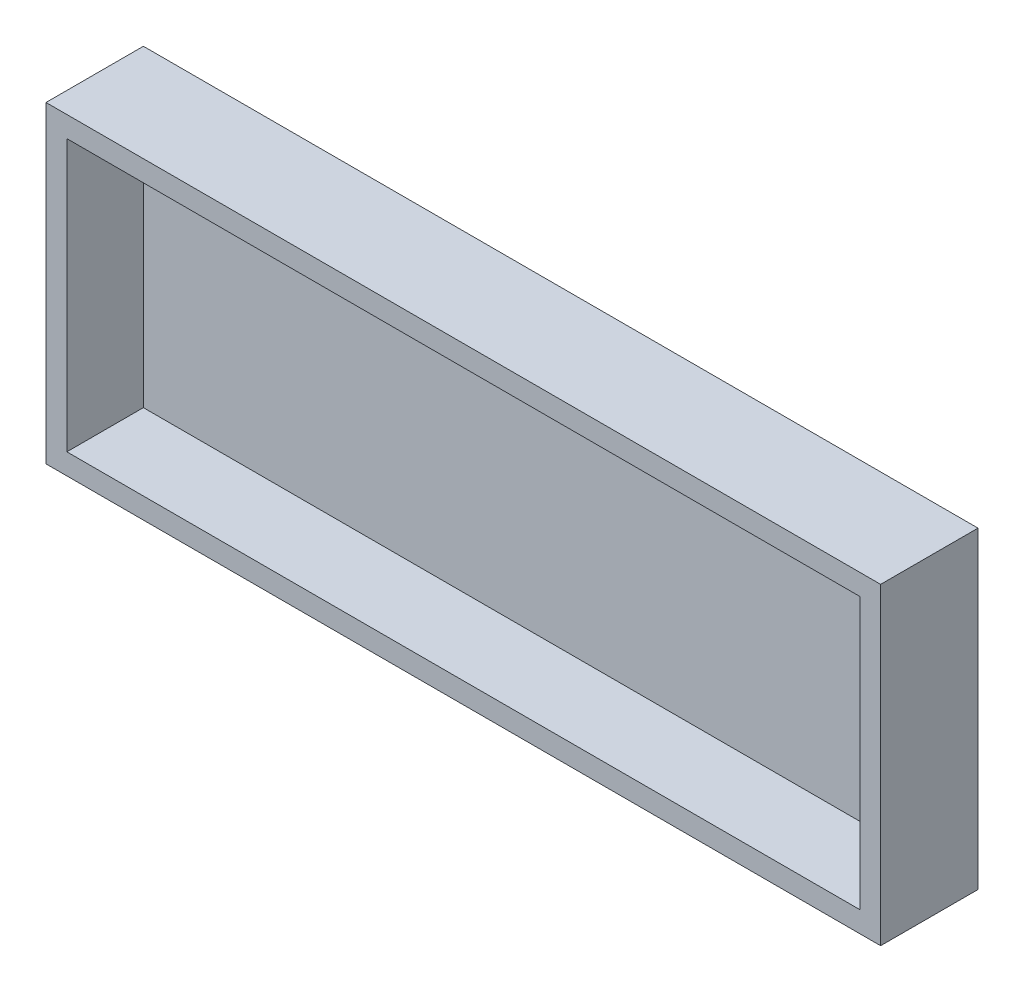
ISO-10303-21;
HEADER;
FILE_DESCRIPTION(('STEP AP214'),'2;1');
FILE_NAME('part.step','',(''),(''),'','','');
FILE_SCHEMA(('AUTOMOTIVE_DESIGN { 1 0 10303 214 1 1 1 1 }'));
ENDSEC;
DATA;
#1=APPLICATION_CONTEXT('core data for automotive mechanical design processes');
#2=APPLICATION_PROTOCOL_DEFINITION('international standard','automotive_design',2000,#1);
#3=PRODUCT_CONTEXT('',#1,'mechanical');
#4=PRODUCT('Part','Part','',(#3));
#5=PRODUCT_RELATED_PRODUCT_CATEGORY('part','',(#4));
#6=PRODUCT_DEFINITION_FORMATION('','',#4);
#7=PRODUCT_DEFINITION_CONTEXT('part definition',#1,'design');
#8=PRODUCT_DEFINITION('design','',#6,#7);
#9=PRODUCT_DEFINITION_SHAPE('','',#8);
#10=(LENGTH_UNIT() NAMED_UNIT(*) SI_UNIT(.MILLI.,.METRE.));
#11=(NAMED_UNIT(*) PLANE_ANGLE_UNIT() SI_UNIT($,.RADIAN.));
#12=(NAMED_UNIT(*) SI_UNIT($,.STERADIAN.) SOLID_ANGLE_UNIT());
#13=UNCERTAINTY_MEASURE_WITH_UNIT(LENGTH_MEASURE(1.E-05),#10,'distance_accuracy_value','');
#14=(GEOMETRIC_REPRESENTATION_CONTEXT(3) GLOBAL_UNCERTAINTY_ASSIGNED_CONTEXT((#13)) GLOBAL_UNIT_ASSIGNED_CONTEXT((#10,
#11,#12)) REPRESENTATION_CONTEXT('',''));
#15=CARTESIAN_POINT('',(0.,0.,0.));
#16=DIRECTION('',(0.,0.,1.));
#17=DIRECTION('',(1.,0.,0.));
#18=AXIS2_PLACEMENT_3D('',#15,#16,#17);
#19=CARTESIAN_POINT('',(60.,22.5,14.));
#20=DIRECTION('',(-1.,0.,0.));
#21=DIRECTION('',(0.,-1.,0.));
#22=AXIS2_PLACEMENT_3D('',#19,#20,#21);
#23=PLANE('',#22);
#24=DIRECTION('',(0.,1.,0.));
#25=VECTOR('',#24,1.);
#26=CARTESIAN_POINT('',(60.,22.5,0.));
#27=LINE('',#26,#25);
#28=CARTESIAN_POINT('',(60.,-22.5,0.));
#29=VERTEX_POINT('',#28);
#30=CARTESIAN_POINT('',(60.,22.5,0.));
#31=VERTEX_POINT('',#30);
#32=EDGE_CURVE('E173',#29,#31,#27,.T.);
#33=ORIENTED_EDGE('',*,*,#32,.T.);
#34=DIRECTION('',(0.,0.,-1.));
#35=VECTOR('',#34,1.);
#36=CARTESIAN_POINT('',(60.,22.5,14.));
#37=LINE('',#36,#35);
#38=CARTESIAN_POINT('',(60.,22.5,14.));
#39=VERTEX_POINT('',#38);
#40=EDGE_CURVE('E11',#39,#31,#37,.T.);
#41=ORIENTED_EDGE('',*,*,#40,.F.);
#42=DIRECTION('',(0.,1.,0.));
#43=VECTOR('',#42,1.);
#44=CARTESIAN_POINT('',(60.,22.5,14.));
#45=LINE('',#44,#43);
#46=CARTESIAN_POINT('',(60.,-22.5,14.));
#47=VERTEX_POINT('',#46);
#48=EDGE_CURVE('E162',#47,#39,#45,.T.);
#49=ORIENTED_EDGE('',*,*,#48,.F.);
#50=DIRECTION('',(0.,0.,-1.));
#51=VECTOR('',#50,1.);
#52=CARTESIAN_POINT('',(60.,-22.5,14.));
#53=LINE('',#52,#51);
#54=EDGE_CURVE('E172',#47,#29,#53,.T.);
#55=ORIENTED_EDGE('',*,*,#54,.T.);
#56=EDGE_LOOP('',(#33,#41,#49,#55));
#57=FACE_BOUND('',#56,.T.);
#58=ADVANCED_FACE('F45',(#57),#23,.F.);
#59=CARTESIAN_POINT('',(-60.,22.5,14.));
#60=DIRECTION('',(0.,-1.,0.));
#61=DIRECTION('',(0.,0.,-1.));
#62=AXIS2_PLACEMENT_3D('',#59,#60,#61);
#63=PLANE('',#62);
#64=DIRECTION('',(-1.,0.,0.));
#65=VECTOR('',#64,1.);
#66=CARTESIAN_POINT('',(-60.,22.5,0.));
#67=LINE('',#66,#65);
#68=CARTESIAN_POINT('',(-60.,22.5,0.));
#69=VERTEX_POINT('',#68);
#70=EDGE_CURVE('E177',#31,#69,#67,.T.);
#71=ORIENTED_EDGE('',*,*,#70,.T.);
#72=DIRECTION('',(0.,0.,-1.));
#73=VECTOR('',#72,1.);
#74=CARTESIAN_POINT('',(-60.,22.5,14.));
#75=LINE('',#74,#73);
#76=CARTESIAN_POINT('',(-60.,22.5,14.));
#77=VERTEX_POINT('',#76);
#78=EDGE_CURVE('E53',#77,#69,#75,.T.);
#79=ORIENTED_EDGE('',*,*,#78,.F.);
#80=DIRECTION('',(-1.,0.,0.));
#81=VECTOR('',#80,1.);
#82=CARTESIAN_POINT('',(-60.,22.5,14.));
#83=LINE('',#82,#81);
#84=EDGE_CURVE('E97',#39,#77,#83,.T.);
#85=ORIENTED_EDGE('',*,*,#84,.F.);
#86=ORIENTED_EDGE('',*,*,#40,.T.);
#87=EDGE_LOOP('',(#71,#79,#85,#86));
#88=FACE_BOUND('',#87,.T.);
#89=ADVANCED_FACE('F213',(#88),#63,.F.);
#90=CARTESIAN_POINT('',(-60.,22.5,14.));
#91=DIRECTION('',(1.,0.,0.));
#92=DIRECTION('',(0.,1.,0.));
#93=AXIS2_PLACEMENT_3D('',#90,#91,#92);
#94=PLANE('',#93);
#95=DIRECTION('',(0.,-1.,0.));
#96=VECTOR('',#95,1.);
#97=CARTESIAN_POINT('',(-60.,22.5,0.));
#98=LINE('',#97,#96);
#99=CARTESIAN_POINT('',(-60.,-22.5,0.));
#100=VERTEX_POINT('',#99);
#101=EDGE_CURVE('E180',#69,#100,#98,.T.);
#102=ORIENTED_EDGE('',*,*,#101,.T.);
#103=DIRECTION('',(0.,0.,-1.));
#104=VECTOR('',#103,1.);
#105=CARTESIAN_POINT('',(-60.,-22.5,14.));
#106=LINE('',#105,#104);
#107=CARTESIAN_POINT('',(-60.,-22.5,14.));
#108=VERTEX_POINT('',#107);
#109=EDGE_CURVE('E187',#108,#100,#106,.T.);
#110=ORIENTED_EDGE('',*,*,#109,.F.);
#111=DIRECTION('',(0.,-1.,0.));
#112=VECTOR('',#111,1.);
#113=CARTESIAN_POINT('',(-60.,22.5,14.));
#114=LINE('',#113,#112);
#115=EDGE_CURVE('E167',#77,#108,#114,.T.);
#116=ORIENTED_EDGE('',*,*,#115,.F.);
#117=ORIENTED_EDGE('',*,*,#78,.T.);
#118=EDGE_LOOP('',(#102,#110,#116,#117));
#119=FACE_BOUND('',#118,.T.);
#120=ADVANCED_FACE('F194',(#119),#94,.F.);
#121=CARTESIAN_POINT('',(-60.,-22.5,14.));
#122=DIRECTION('',(0.,1.,0.));
#123=DIRECTION('',(0.,0.,1.));
#124=AXIS2_PLACEMENT_3D('',#121,#122,#123);
#125=PLANE('',#124);
#126=DIRECTION('',(1.,0.,0.));
#127=VECTOR('',#126,1.);
#128=CARTESIAN_POINT('',(-60.,-22.5,0.));
#129=LINE('',#128,#127);
#130=EDGE_CURVE('E90',#100,#29,#129,.T.);
#131=ORIENTED_EDGE('',*,*,#130,.T.);
#132=ORIENTED_EDGE('',*,*,#54,.F.);
#133=DIRECTION('',(1.,0.,0.));
#134=VECTOR('',#133,1.);
#135=CARTESIAN_POINT('',(-60.,-22.5,14.));
#136=LINE('',#135,#134);
#137=EDGE_CURVE('E69',#108,#47,#136,.T.);
#138=ORIENTED_EDGE('',*,*,#137,.F.);
#139=ORIENTED_EDGE('',*,*,#109,.T.);
#140=EDGE_LOOP('',(#131,#132,#138,#139));
#141=FACE_BOUND('',#140,.T.);
#142=ADVANCED_FACE('F202',(#141),#125,.F.);
#143=CARTESIAN_POINT('',(0.,0.,14.));
#144=DIRECTION('',(0.,0.,1.));
#145=DIRECTION('',(1.,0.,0.));
#146=AXIS2_PLACEMENT_3D('',#143,#144,#145);
#147=PLANE('',#146);
#148=DIRECTION('',(0.,1.,0.));
#149=VECTOR('',#148,1.);
#150=CARTESIAN_POINT('',(57.,22.5,14.));
#151=LINE('',#150,#149);
#152=CARTESIAN_POINT('',(57.,-19.5,14.));
#153=VERTEX_POINT('',#152);
#154=CARTESIAN_POINT('',(57.,19.5,14.));
#155=VERTEX_POINT('',#154);
#156=EDGE_CURVE('E146',#153,#155,#151,.T.);
#157=ORIENTED_EDGE('',*,*,#156,.F.);
#158=DIRECTION('',(1.,0.,0.));
#159=VECTOR('',#158,1.);
#160=CARTESIAN_POINT('',(-60.,-19.5,14.));
#161=LINE('',#160,#159);
#162=CARTESIAN_POINT('',(-57.,-19.5,14.));
#163=VERTEX_POINT('',#162);
#164=EDGE_CURVE('E159',#163,#153,#161,.T.);
#165=ORIENTED_EDGE('',*,*,#164,.F.);
#166=DIRECTION('',(0.,-1.,0.));
#167=VECTOR('',#166,1.);
#168=CARTESIAN_POINT('',(-57.,22.5,14.));
#169=LINE('',#168,#167);
#170=CARTESIAN_POINT('',(-57.,19.5,14.));
#171=VERTEX_POINT('',#170);
#172=EDGE_CURVE('E156',#171,#163,#169,.T.);
#173=ORIENTED_EDGE('',*,*,#172,.F.);
#174=DIRECTION('',(-1.,0.,0.));
#175=VECTOR('',#174,1.);
#176=CARTESIAN_POINT('',(-60.,19.5,14.));
#177=LINE('',#176,#175);
#178=EDGE_CURVE('E135',#155,#171,#177,.T.);
#179=ORIENTED_EDGE('',*,*,#178,.F.);
#180=EDGE_LOOP('',(#157,#165,#173,#179));
#181=FACE_BOUND('',#180,.T.);
#182=ORIENTED_EDGE('',*,*,#48,.T.);
#183=ORIENTED_EDGE('',*,*,#84,.T.);
#184=ORIENTED_EDGE('',*,*,#115,.T.);
#185=ORIENTED_EDGE('',*,*,#137,.T.);
#186=EDGE_LOOP('',(#182,#183,#184,#185));
#187=FACE_BOUND('',#186,.T.);
#188=ADVANCED_FACE('F204',(#181,#187),#147,.T.);
#189=CARTESIAN_POINT('',(0.,0.,0.));
#190=DIRECTION('',(0.,0.,1.));
#191=DIRECTION('',(1.,0.,0.));
#192=AXIS2_PLACEMENT_3D('',#189,#190,#191);
#193=PLANE('',#192);
#194=ORIENTED_EDGE('',*,*,#32,.F.);
#195=ORIENTED_EDGE('',*,*,#130,.F.);
#196=ORIENTED_EDGE('',*,*,#101,.F.);
#197=ORIENTED_EDGE('',*,*,#70,.F.);
#198=EDGE_LOOP('',(#194,#195,#196,#197));
#199=FACE_BOUND('',#198,.T.);
#200=ADVANCED_FACE('F198',(#199),#193,.F.);
#201=CARTESIAN_POINT('',(57.,22.5,14.));
#202=DIRECTION('',(-1.,0.,0.));
#203=DIRECTION('',(0.,-1.,0.));
#204=AXIS2_PLACEMENT_3D('',#201,#202,#203);
#205=PLANE('',#204);
#206=DIRECTION('',(0.,1.,0.));
#207=VECTOR('',#206,1.);
#208=CARTESIAN_POINT('',(57.,22.5,3.));
#209=LINE('',#208,#207);
#210=CARTESIAN_POINT('',(57.,-19.5,3.));
#211=VERTEX_POINT('',#210);
#212=CARTESIAN_POINT('',(57.,19.5,3.));
#213=VERTEX_POINT('',#212);
#214=EDGE_CURVE('E125',#211,#213,#209,.T.);
#215=ORIENTED_EDGE('',*,*,#214,.F.);
#216=DIRECTION('',(0.,0.,-1.));
#217=VECTOR('',#216,1.);
#218=CARTESIAN_POINT('',(57.,-19.5,14.));
#219=LINE('',#218,#217);
#220=EDGE_CURVE('E150',#153,#211,#219,.T.);
#221=ORIENTED_EDGE('',*,*,#220,.F.);
#222=ORIENTED_EDGE('',*,*,#156,.T.);
#223=DIRECTION('',(0.,0.,-1.));
#224=VECTOR('',#223,1.);
#225=CARTESIAN_POINT('',(57.,19.5,14.));
#226=LINE('',#225,#224);
#227=EDGE_CURVE('E139',#155,#213,#226,.T.);
#228=ORIENTED_EDGE('',*,*,#227,.T.);
#229=EDGE_LOOP('',(#215,#221,#222,#228));
#230=FACE_BOUND('',#229,.T.);
#231=ADVANCED_FACE('F247',(#230),#205,.T.);
#232=CARTESIAN_POINT('',(-60.,19.5,14.));
#233=DIRECTION('',(0.,-1.,0.));
#234=DIRECTION('',(0.,0.,-1.));
#235=AXIS2_PLACEMENT_3D('',#232,#233,#234);
#236=PLANE('',#235);
#237=DIRECTION('',(-1.,0.,0.));
#238=VECTOR('',#237,1.);
#239=CARTESIAN_POINT('',(-60.,19.5,3.));
#240=LINE('',#239,#238);
#241=CARTESIAN_POINT('',(-57.,19.5,3.));
#242=VERTEX_POINT('',#241);
#243=EDGE_CURVE('E119',#213,#242,#240,.T.);
#244=ORIENTED_EDGE('',*,*,#243,.F.);
#245=ORIENTED_EDGE('',*,*,#227,.F.);
#246=ORIENTED_EDGE('',*,*,#178,.T.);
#247=DIRECTION('',(0.,0.,-1.));
#248=VECTOR('',#247,1.);
#249=CARTESIAN_POINT('',(-57.,19.5,14.));
#250=LINE('',#249,#248);
#251=EDGE_CURVE('E132',#171,#242,#250,.T.);
#252=ORIENTED_EDGE('',*,*,#251,.T.);
#253=EDGE_LOOP('',(#244,#245,#246,#252));
#254=FACE_BOUND('',#253,.T.);
#255=ADVANCED_FACE('F133',(#254),#236,.T.);
#256=CARTESIAN_POINT('',(-57.,22.5,14.));
#257=DIRECTION('',(1.,0.,0.));
#258=DIRECTION('',(0.,1.,0.));
#259=AXIS2_PLACEMENT_3D('',#256,#257,#258);
#260=PLANE('',#259);
#261=DIRECTION('',(0.,-1.,0.));
#262=VECTOR('',#261,1.);
#263=CARTESIAN_POINT('',(-57.,22.5,3.));
#264=LINE('',#263,#262);
#265=CARTESIAN_POINT('',(-57.,-19.5,3.));
#266=VERTEX_POINT('',#265);
#267=EDGE_CURVE('E123',#242,#266,#264,.T.);
#268=ORIENTED_EDGE('',*,*,#267,.F.);
#269=ORIENTED_EDGE('',*,*,#251,.F.);
#270=ORIENTED_EDGE('',*,*,#172,.T.);
#271=DIRECTION('',(0.,0.,-1.));
#272=VECTOR('',#271,1.);
#273=CARTESIAN_POINT('',(-57.,-19.5,14.));
#274=LINE('',#273,#272);
#275=EDGE_CURVE('E60',#163,#266,#274,.T.);
#276=ORIENTED_EDGE('',*,*,#275,.T.);
#277=EDGE_LOOP('',(#268,#269,#270,#276));
#278=FACE_BOUND('',#277,.T.);
#279=ADVANCED_FACE('F141',(#278),#260,.T.);
#280=CARTESIAN_POINT('',(-60.,-19.5,14.));
#281=DIRECTION('',(0.,1.,0.));
#282=DIRECTION('',(0.,0.,1.));
#283=AXIS2_PLACEMENT_3D('',#280,#281,#282);
#284=PLANE('',#283);
#285=DIRECTION('',(1.,0.,0.));
#286=VECTOR('',#285,1.);
#287=CARTESIAN_POINT('',(-60.,-19.5,3.));
#288=LINE('',#287,#286);
#289=EDGE_CURVE('E143',#266,#211,#288,.T.);
#290=ORIENTED_EDGE('',*,*,#289,.F.);
#291=ORIENTED_EDGE('',*,*,#275,.F.);
#292=ORIENTED_EDGE('',*,*,#164,.T.);
#293=ORIENTED_EDGE('',*,*,#220,.T.);
#294=EDGE_LOOP('',(#290,#291,#292,#293));
#295=FACE_BOUND('',#294,.T.);
#296=ADVANCED_FACE('F271',(#295),#284,.T.);
#297=CARTESIAN_POINT('',(0.,0.,3.));
#298=DIRECTION('',(0.,0.,1.));
#299=DIRECTION('',(1.,0.,0.));
#300=AXIS2_PLACEMENT_3D('',#297,#298,#299);
#301=PLANE('',#300);
#302=ORIENTED_EDGE('',*,*,#214,.T.);
#303=ORIENTED_EDGE('',*,*,#243,.T.);
#304=ORIENTED_EDGE('',*,*,#267,.T.);
#305=ORIENTED_EDGE('',*,*,#289,.T.);
#306=EDGE_LOOP('',(#302,#303,#304,#305));
#307=FACE_BOUND('',#306,.T.);
#308=ADVANCED_FACE('F121',(#307),#301,.T.);
#309=CLOSED_SHELL('',(#58,#89,#120,#142,#188,#200,#231,#255,#279,#296,#308));
#310=MANIFOLD_SOLID_BREP('B2',#309);
#311=ADVANCED_BREP_SHAPE_REPRESENTATION('',(#18,#310),#14);
#312=SHAPE_DEFINITION_REPRESENTATION(#9,#311);
ENDSEC;
END-ISO-10303-21;
